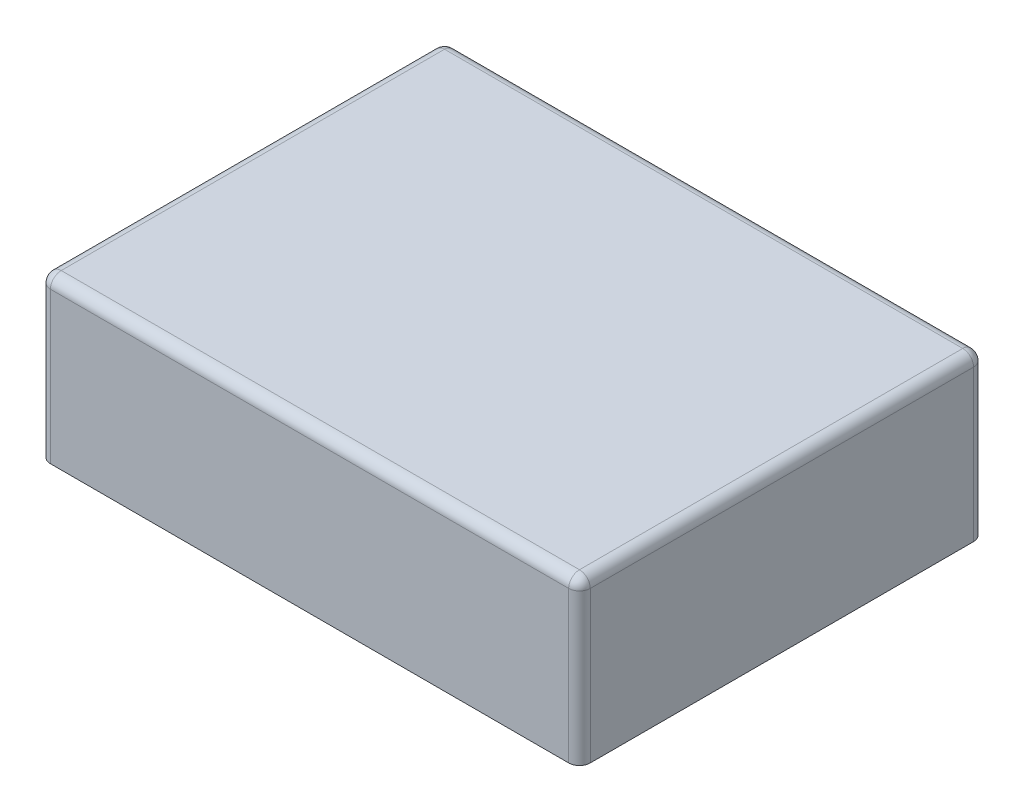
ISO-10303-21;
HEADER;
FILE_DESCRIPTION(('STEP AP214'),'2;1');
FILE_NAME('part.step','',(''),(''),'','','');
FILE_SCHEMA(('AUTOMOTIVE_DESIGN { 1 0 10303 214 1 1 1 1 }'));
ENDSEC;
DATA;
#1=APPLICATION_CONTEXT('core data for automotive mechanical design processes');
#2=APPLICATION_PROTOCOL_DEFINITION('international standard','automotive_design',2000,#1);
#3=PRODUCT_CONTEXT('',#1,'mechanical');
#4=PRODUCT('Part','Part','',(#3));
#5=PRODUCT_RELATED_PRODUCT_CATEGORY('part','',(#4));
#6=PRODUCT_DEFINITION_FORMATION('','',#4);
#7=PRODUCT_DEFINITION_CONTEXT('part definition',#1,'design');
#8=PRODUCT_DEFINITION('design','',#6,#7);
#9=PRODUCT_DEFINITION_SHAPE('','',#8);
#10=(LENGTH_UNIT() NAMED_UNIT(*) SI_UNIT(.MILLI.,.METRE.));
#11=(NAMED_UNIT(*) PLANE_ANGLE_UNIT() SI_UNIT($,.RADIAN.));
#12=(NAMED_UNIT(*) SI_UNIT($,.STERADIAN.) SOLID_ANGLE_UNIT());
#13=UNCERTAINTY_MEASURE_WITH_UNIT(LENGTH_MEASURE(1.E-05),#10,'distance_accuracy_value','');
#14=(GEOMETRIC_REPRESENTATION_CONTEXT(3) GLOBAL_UNCERTAINTY_ASSIGNED_CONTEXT((#13)) GLOBAL_UNIT_ASSIGNED_CONTEXT((#10,
#11,#12)) REPRESENTATION_CONTEXT('',''));
#15=CARTESIAN_POINT('',(0.,0.,0.));
#16=DIRECTION('',(0.,0.,1.));
#17=DIRECTION('',(1.,0.,0.));
#18=AXIS2_PLACEMENT_3D('',#15,#16,#17);
#19=CARTESIAN_POINT('',(50.,30.,-37.5));
#20=DIRECTION('',(-1.,0.,0.));
#21=DIRECTION('',(0.,0.,1.));
#22=AXIS2_PLACEMENT_3D('',#19,#20,#21);
#23=PLANE('',#22);
#24=DIRECTION('',(0.,0.,-1.));
#25=VECTOR('',#24,1.);
#26=CARTESIAN_POINT('',(50.,0.,-37.5));
#27=LINE('',#26,#25);
#28=CARTESIAN_POINT('',(50.,0.,35.5));
#29=VERTEX_POINT('',#28);
#30=CARTESIAN_POINT('',(50.,0.,-35.5));
#31=VERTEX_POINT('',#30);
#32=EDGE_CURVE('E159',#29,#31,#27,.T.);
#33=ORIENTED_EDGE('',*,*,#32,.T.);
#34=DIRECTION('',(0.,-1.,0.));
#35=VECTOR('',#34,1.);
#36=CARTESIAN_POINT('',(50.,30.,-35.5));
#37=LINE('',#36,#35);
#38=CARTESIAN_POINT('',(50.,28.,-35.5));
#39=VERTEX_POINT('',#38);
#40=EDGE_CURVE('E50',#31,#39,#37,.F.);
#41=ORIENTED_EDGE('',*,*,#40,.T.);
#42=DIRECTION('',(0.,0.,-1.));
#43=VECTOR('',#42,1.);
#44=CARTESIAN_POINT('',(50.,28.,37.5));
#45=LINE('',#44,#43);
#46=CARTESIAN_POINT('',(50.,28.,35.5));
#47=VERTEX_POINT('',#46);
#48=EDGE_CURVE('E55',#39,#47,#45,.F.);
#49=ORIENTED_EDGE('',*,*,#48,.T.);
#50=DIRECTION('',(0.,-1.,0.));
#51=VECTOR('',#50,1.);
#52=CARTESIAN_POINT('',(50.,30.,35.5));
#53=LINE('',#52,#51);
#54=EDGE_CURVE('E216',#47,#29,#53,.T.);
#55=ORIENTED_EDGE('',*,*,#54,.T.);
#56=EDGE_LOOP('',(#33,#41,#49,#55));
#57=FACE_BOUND('',#56,.T.);
#58=ADVANCED_FACE('F33',(#57),#23,.F.);
#59=CARTESIAN_POINT('',(-50.,30.,-37.5));
#60=DIRECTION('',(0.,0.,1.));
#61=DIRECTION('',(1.,0.,0.));
#62=AXIS2_PLACEMENT_3D('',#59,#60,#61);
#63=PLANE('',#62);
#64=DIRECTION('',(-1.,0.,0.));
#65=VECTOR('',#64,1.);
#66=CARTESIAN_POINT('',(-50.,0.,-37.5));
#67=LINE('',#66,#65);
#68=CARTESIAN_POINT('',(48.,0.,-37.5));
#69=VERTEX_POINT('',#68);
#70=CARTESIAN_POINT('',(-48.,0.,-37.5));
#71=VERTEX_POINT('',#70);
#72=EDGE_CURVE('E162',#69,#71,#67,.T.);
#73=ORIENTED_EDGE('',*,*,#72,.T.);
#74=DIRECTION('',(0.,-1.,0.));
#75=VECTOR('',#74,1.);
#76=CARTESIAN_POINT('',(-48.,30.,-37.5));
#77=LINE('',#76,#75);
#78=CARTESIAN_POINT('',(-48.,28.,-37.5));
#79=VERTEX_POINT('',#78);
#80=EDGE_CURVE('E214',#71,#79,#77,.F.);
#81=ORIENTED_EDGE('',*,*,#80,.T.);
#82=DIRECTION('',(-1.,0.,0.));
#83=VECTOR('',#82,1.);
#84=CARTESIAN_POINT('',(50.,28.,-37.5));
#85=LINE('',#84,#83);
#86=CARTESIAN_POINT('',(48.,28.,-37.5));
#87=VERTEX_POINT('',#86);
#88=EDGE_CURVE('E212',#79,#87,#85,.F.);
#89=ORIENTED_EDGE('',*,*,#88,.T.);
#90=DIRECTION('',(0.,-1.,0.));
#91=VECTOR('',#90,1.);
#92=CARTESIAN_POINT('',(48.,30.,-37.5));
#93=LINE('',#92,#91);
#94=EDGE_CURVE('E210',#87,#69,#93,.T.);
#95=ORIENTED_EDGE('',*,*,#94,.T.);
#96=EDGE_LOOP('',(#73,#81,#89,#95));
#97=FACE_BOUND('',#96,.T.);
#98=ADVANCED_FACE('F281',(#97),#63,.F.);
#99=CARTESIAN_POINT('',(-50.,30.,-37.5));
#100=DIRECTION('',(1.,0.,0.));
#101=DIRECTION('',(0.,0.,-1.));
#102=AXIS2_PLACEMENT_3D('',#99,#100,#101);
#103=PLANE('',#102);
#104=DIRECTION('',(0.,0.,1.));
#105=VECTOR('',#104,1.);
#106=CARTESIAN_POINT('',(-50.,28.,-37.5));
#107=LINE('',#106,#105);
#108=CARTESIAN_POINT('',(-50.,28.,35.5));
#109=VERTEX_POINT('',#108);
#110=CARTESIAN_POINT('',(-50.,28.,-35.5));
#111=VERTEX_POINT('',#110);
#112=EDGE_CURVE('E206',#109,#111,#107,.F.);
#113=ORIENTED_EDGE('',*,*,#112,.T.);
#114=DIRECTION('',(0.,-1.,0.));
#115=VECTOR('',#114,1.);
#116=CARTESIAN_POINT('',(-50.,30.,-35.5));
#117=LINE('',#116,#115);
#118=CARTESIAN_POINT('',(-50.,0.,-35.5));
#119=VERTEX_POINT('',#118);
#120=EDGE_CURVE('E208',#111,#119,#117,.T.);
#121=ORIENTED_EDGE('',*,*,#120,.T.);
#122=DIRECTION('',(0.,0.,1.));
#123=VECTOR('',#122,1.);
#124=CARTESIAN_POINT('',(-50.,0.,-37.5));
#125=LINE('',#124,#123);
#126=CARTESIAN_POINT('',(-50.,0.,35.5));
#127=VERTEX_POINT('',#126);
#128=EDGE_CURVE('E182',#119,#127,#125,.T.);
#129=ORIENTED_EDGE('',*,*,#128,.T.);
#130=DIRECTION('',(0.,-1.,0.));
#131=VECTOR('',#130,1.);
#132=CARTESIAN_POINT('',(-50.,30.,35.5));
#133=LINE('',#132,#131);
#134=EDGE_CURVE('E204',#127,#109,#133,.F.);
#135=ORIENTED_EDGE('',*,*,#134,.T.);
#136=EDGE_LOOP('',(#113,#121,#129,#135));
#137=FACE_BOUND('',#136,.T.);
#138=ADVANCED_FACE('F314',(#137),#103,.F.);
#139=CARTESIAN_POINT('',(-50.,30.,37.5));
#140=DIRECTION('',(0.,0.,-1.));
#141=DIRECTION('',(-1.,0.,0.));
#142=AXIS2_PLACEMENT_3D('',#139,#140,#141);
#143=PLANE('',#142);
#144=DIRECTION('',(1.,0.,0.));
#145=VECTOR('',#144,1.);
#146=CARTESIAN_POINT('',(-50.,0.,37.5));
#147=LINE('',#146,#145);
#148=CARTESIAN_POINT('',(-48.,0.,37.5));
#149=VERTEX_POINT('',#148);
#150=CARTESIAN_POINT('',(48.,0.,37.5));
#151=VERTEX_POINT('',#150);
#152=EDGE_CURVE('E185',#149,#151,#147,.T.);
#153=ORIENTED_EDGE('',*,*,#152,.T.);
#154=DIRECTION('',(0.,-1.,0.));
#155=VECTOR('',#154,1.);
#156=CARTESIAN_POINT('',(48.,30.,37.5));
#157=LINE('',#156,#155);
#158=CARTESIAN_POINT('',(48.,28.,37.5));
#159=VERTEX_POINT('',#158);
#160=EDGE_CURVE('E202',#151,#159,#157,.F.);
#161=ORIENTED_EDGE('',*,*,#160,.T.);
#162=DIRECTION('',(1.,0.,0.));
#163=VECTOR('',#162,1.);
#164=CARTESIAN_POINT('',(-50.,28.,37.5));
#165=LINE('',#164,#163);
#166=CARTESIAN_POINT('',(-48.,28.,37.5));
#167=VERTEX_POINT('',#166);
#168=EDGE_CURVE('E199',#159,#167,#165,.F.);
#169=ORIENTED_EDGE('',*,*,#168,.T.);
#170=DIRECTION('',(0.,-1.,0.));
#171=VECTOR('',#170,1.);
#172=CARTESIAN_POINT('',(-48.,30.,37.5));
#173=LINE('',#172,#171);
#174=EDGE_CURVE('E197',#167,#149,#173,.T.);
#175=ORIENTED_EDGE('',*,*,#174,.T.);
#176=EDGE_LOOP('',(#153,#161,#169,#175));
#177=FACE_BOUND('',#176,.T.);
#178=ADVANCED_FACE('F306',(#177),#143,.F.);
#179=CARTESIAN_POINT('',(0.,30.,0.));
#180=DIRECTION('',(0.,1.,0.));
#181=DIRECTION('',(0.,0.,1.));
#182=AXIS2_PLACEMENT_3D('',#179,#180,#181);
#183=PLANE('',#182);
#184=DIRECTION('',(0.,0.,1.));
#185=VECTOR('',#184,1.);
#186=CARTESIAN_POINT('',(-48.,30.,37.5));
#187=LINE('',#186,#185);
#188=CARTESIAN_POINT('',(-48.,30.,-35.5));
#189=VERTEX_POINT('',#188);
#190=CARTESIAN_POINT('',(-48.,30.,35.5));
#191=VERTEX_POINT('',#190);
#192=EDGE_CURVE('E192',#189,#191,#187,.T.);
#193=ORIENTED_EDGE('',*,*,#192,.T.);
#194=DIRECTION('',(1.,0.,0.));
#195=VECTOR('',#194,1.);
#196=CARTESIAN_POINT('',(50.,30.,35.5));
#197=LINE('',#196,#195);
#198=CARTESIAN_POINT('',(48.,30.,35.5));
#199=VERTEX_POINT('',#198);
#200=EDGE_CURVE('E194',#191,#199,#197,.T.);
#201=ORIENTED_EDGE('',*,*,#200,.T.);
#202=DIRECTION('',(0.,0.,-1.));
#203=VECTOR('',#202,1.);
#204=CARTESIAN_POINT('',(48.,30.,-37.5));
#205=LINE('',#204,#203);
#206=CARTESIAN_POINT('',(48.,30.,-35.5));
#207=VERTEX_POINT('',#206);
#208=EDGE_CURVE('E188',#199,#207,#205,.T.);
#209=ORIENTED_EDGE('',*,*,#208,.T.);
#210=DIRECTION('',(-1.,0.,0.));
#211=VECTOR('',#210,1.);
#212=CARTESIAN_POINT('',(-50.,30.,-35.5));
#213=LINE('',#212,#211);
#214=EDGE_CURVE('E190',#207,#189,#213,.T.);
#215=ORIENTED_EDGE('',*,*,#214,.T.);
#216=EDGE_LOOP('',(#193,#201,#209,#215));
#217=FACE_BOUND('',#216,.T.);
#218=ADVANCED_FACE('F271',(#217),#183,.T.);
#219=CARTESIAN_POINT('',(0.,0.,0.));
#220=DIRECTION('',(0.,1.,0.));
#221=DIRECTION('',(0.,0.,1.));
#222=AXIS2_PLACEMENT_3D('',#219,#220,#221);
#223=PLANE('',#222);
#224=DIRECTION('',(1.,0.,0.));
#225=VECTOR('',#224,1.);
#226=CARTESIAN_POINT('',(-50.,0.,35.5));
#227=LINE('',#226,#225);
#228=CARTESIAN_POINT('',(-48.,0.,35.5));
#229=VERTEX_POINT('',#228);
#230=CARTESIAN_POINT('',(48.,0.,35.5));
#231=VERTEX_POINT('',#230);
#232=EDGE_CURVE('E154',#229,#231,#227,.T.);
#233=ORIENTED_EDGE('',*,*,#232,.T.);
#234=DIRECTION('',(0.,0.,-1.));
#235=VECTOR('',#234,1.);
#236=CARTESIAN_POINT('',(48.,0.,-37.5));
#237=LINE('',#236,#235);
#238=CARTESIAN_POINT('',(48.,0.,-35.5));
#239=VERTEX_POINT('',#238);
#240=EDGE_CURVE('E172',#231,#239,#237,.T.);
#241=ORIENTED_EDGE('',*,*,#240,.T.);
#242=DIRECTION('',(-1.,0.,0.));
#243=VECTOR('',#242,1.);
#244=CARTESIAN_POINT('',(-50.,0.,-35.5));
#245=LINE('',#244,#243);
#246=CARTESIAN_POINT('',(-48.,0.,-35.5));
#247=VERTEX_POINT('',#246);
#248=EDGE_CURVE('E158',#239,#247,#245,.T.);
#249=ORIENTED_EDGE('',*,*,#248,.T.);
#250=DIRECTION('',(0.,0.,1.));
#251=VECTOR('',#250,1.);
#252=CARTESIAN_POINT('',(-48.,0.,-37.5));
#253=LINE('',#252,#251);
#254=EDGE_CURVE('E176',#247,#229,#253,.T.);
#255=ORIENTED_EDGE('',*,*,#254,.T.);
#256=EDGE_LOOP('',(#233,#241,#249,#255));
#257=FACE_BOUND('',#256,.T.);
#258=ORIENTED_EDGE('',*,*,#128,.F.);
#259=CARTESIAN_POINT('',(-48.,0.,-35.5));
#260=DIRECTION('',(0.,1.,0.));
#261=DIRECTION('',(0.,0.,1.));
#262=AXIS2_PLACEMENT_3D('',#259,#260,#261);
#263=CIRCLE('',#262,2.);
#264=EDGE_CURVE('E11',#119,#71,#263,.F.);
#265=ORIENTED_EDGE('',*,*,#264,.T.);
#266=ORIENTED_EDGE('',*,*,#72,.F.);
#267=CARTESIAN_POINT('',(48.,0.,-35.5));
#268=DIRECTION('',(0.,1.,0.));
#269=DIRECTION('',(0.,0.,1.));
#270=AXIS2_PLACEMENT_3D('',#267,#268,#269);
#271=CIRCLE('',#270,2.);
#272=EDGE_CURVE('E42',#69,#31,#271,.F.);
#273=ORIENTED_EDGE('',*,*,#272,.T.);
#274=ORIENTED_EDGE('',*,*,#32,.F.);
#275=CARTESIAN_POINT('',(48.,0.,35.5));
#276=DIRECTION('',(0.,1.,0.));
#277=DIRECTION('',(0.,0.,1.));
#278=AXIS2_PLACEMENT_3D('',#275,#276,#277);
#279=CIRCLE('',#278,2.);
#280=EDGE_CURVE('E222',#29,#151,#279,.F.);
#281=ORIENTED_EDGE('',*,*,#280,.T.);
#282=ORIENTED_EDGE('',*,*,#152,.F.);
#283=CARTESIAN_POINT('',(-48.,0.,35.5));
#284=DIRECTION('',(0.,1.,0.));
#285=DIRECTION('',(0.,0.,1.));
#286=AXIS2_PLACEMENT_3D('',#283,#284,#285);
#287=CIRCLE('',#286,2.);
#288=EDGE_CURVE('E220',#149,#127,#287,.F.);
#289=ORIENTED_EDGE('',*,*,#288,.T.);
#290=EDGE_LOOP('',(#258,#265,#266,#273,#274,#281,#282,#289));
#291=FACE_BOUND('',#290,.T.);
#292=ADVANCED_FACE('F290',(#257,#291),#223,.F.);
#293=CARTESIAN_POINT('',(48.,30.,-37.5));
#294=DIRECTION('',(-1.,0.,0.));
#295=DIRECTION('',(0.,0.,1.));
#296=AXIS2_PLACEMENT_3D('',#293,#294,#295);
#297=PLANE('',#296);
#298=ORIENTED_EDGE('',*,*,#240,.F.);
#299=DIRECTION('',(0.,-1.,0.));
#300=VECTOR('',#299,1.);
#301=CARTESIAN_POINT('',(48.,30.,35.5));
#302=LINE('',#301,#300);
#303=CARTESIAN_POINT('',(48.,28.,35.5));
#304=VERTEX_POINT('',#303);
#305=EDGE_CURVE('E153',#304,#231,#302,.T.);
#306=ORIENTED_EDGE('',*,*,#305,.F.);
#307=DIRECTION('',(0.,0.,-1.));
#308=VECTOR('',#307,1.);
#309=CARTESIAN_POINT('',(48.,28.,-37.5));
#310=LINE('',#309,#308);
#311=CARTESIAN_POINT('',(48.,28.,-35.5));
#312=VERTEX_POINT('',#311);
#313=EDGE_CURVE('E139',#304,#312,#310,.T.);
#314=ORIENTED_EDGE('',*,*,#313,.T.);
#315=DIRECTION('',(0.,-1.,0.));
#316=VECTOR('',#315,1.);
#317=CARTESIAN_POINT('',(48.,30.,-35.5));
#318=LINE('',#317,#316);
#319=EDGE_CURVE('E151',#312,#239,#318,.T.);
#320=ORIENTED_EDGE('',*,*,#319,.T.);
#321=EDGE_LOOP('',(#298,#306,#314,#320));
#322=FACE_BOUND('',#321,.T.);
#323=ADVANCED_FACE('F150',(#322),#297,.T.);
#324=CARTESIAN_POINT('',(-50.,30.,-35.5));
#325=DIRECTION('',(0.,0.,1.));
#326=DIRECTION('',(1.,0.,0.));
#327=AXIS2_PLACEMENT_3D('',#324,#325,#326);
#328=PLANE('',#327);
#329=ORIENTED_EDGE('',*,*,#248,.F.);
#330=ORIENTED_EDGE('',*,*,#319,.F.);
#331=DIRECTION('',(-1.,0.,0.));
#332=VECTOR('',#331,1.);
#333=CARTESIAN_POINT('',(-50.,28.,-35.5));
#334=LINE('',#333,#332);
#335=CARTESIAN_POINT('',(-48.,28.,-35.5));
#336=VERTEX_POINT('',#335);
#337=EDGE_CURVE('E135',#312,#336,#334,.T.);
#338=ORIENTED_EDGE('',*,*,#337,.T.);
#339=DIRECTION('',(0.,-1.,0.));
#340=VECTOR('',#339,1.);
#341=CARTESIAN_POINT('',(-48.,30.,-35.5));
#342=LINE('',#341,#340);
#343=EDGE_CURVE('E160',#336,#247,#342,.T.);
#344=ORIENTED_EDGE('',*,*,#343,.T.);
#345=EDGE_LOOP('',(#329,#330,#338,#344));
#346=FACE_BOUND('',#345,.T.);
#347=ADVANCED_FACE('F156',(#346),#328,.T.);
#348=CARTESIAN_POINT('',(-48.,30.,-37.5));
#349=DIRECTION('',(1.,0.,0.));
#350=DIRECTION('',(0.,0.,-1.));
#351=AXIS2_PLACEMENT_3D('',#348,#349,#350);
#352=PLANE('',#351);
#353=ORIENTED_EDGE('',*,*,#254,.F.);
#354=ORIENTED_EDGE('',*,*,#343,.F.);
#355=DIRECTION('',(0.,0.,1.));
#356=VECTOR('',#355,1.);
#357=CARTESIAN_POINT('',(-48.,28.,-37.5));
#358=LINE('',#357,#356);
#359=CARTESIAN_POINT('',(-48.,28.,35.5));
#360=VERTEX_POINT('',#359);
#361=EDGE_CURVE('E140',#336,#360,#358,.T.);
#362=ORIENTED_EDGE('',*,*,#361,.T.);
#363=DIRECTION('',(0.,-1.,0.));
#364=VECTOR('',#363,1.);
#365=CARTESIAN_POINT('',(-48.,30.,35.5));
#366=LINE('',#365,#364);
#367=EDGE_CURVE('E164',#360,#229,#366,.T.);
#368=ORIENTED_EDGE('',*,*,#367,.T.);
#369=EDGE_LOOP('',(#353,#354,#362,#368));
#370=FACE_BOUND('',#369,.T.);
#371=ADVANCED_FACE('F436',(#370),#352,.T.);
#372=CARTESIAN_POINT('',(-50.,30.,35.5));
#373=DIRECTION('',(0.,0.,-1.));
#374=DIRECTION('',(-1.,0.,0.));
#375=AXIS2_PLACEMENT_3D('',#372,#373,#374);
#376=PLANE('',#375);
#377=ORIENTED_EDGE('',*,*,#232,.F.);
#378=ORIENTED_EDGE('',*,*,#367,.F.);
#379=DIRECTION('',(1.,0.,0.));
#380=VECTOR('',#379,1.);
#381=CARTESIAN_POINT('',(-50.,28.,35.5));
#382=LINE('',#381,#380);
#383=EDGE_CURVE('E167',#360,#304,#382,.T.);
#384=ORIENTED_EDGE('',*,*,#383,.T.);
#385=ORIENTED_EDGE('',*,*,#305,.T.);
#386=EDGE_LOOP('',(#377,#378,#384,#385));
#387=FACE_BOUND('',#386,.T.);
#388=ADVANCED_FACE('F321',(#387),#376,.T.);
#389=CARTESIAN_POINT('',(0.,28.,0.));
#390=DIRECTION('',(0.,1.,0.));
#391=DIRECTION('',(0.,0.,1.));
#392=AXIS2_PLACEMENT_3D('',#389,#390,#391);
#393=PLANE('',#392);
#394=ORIENTED_EDGE('',*,*,#313,.F.);
#395=ORIENTED_EDGE('',*,*,#383,.F.);
#396=ORIENTED_EDGE('',*,*,#361,.F.);
#397=ORIENTED_EDGE('',*,*,#337,.F.);
#398=EDGE_LOOP('',(#394,#395,#396,#397));
#399=FACE_BOUND('',#398,.T.);
#400=ADVANCED_FACE('F137',(#399),#393,.F.);
#401=CARTESIAN_POINT('',(-48.,30.,-35.5));
#402=DIRECTION('',(0.,-1.,0.));
#403=DIRECTION('',(0.,0.,-1.));
#404=AXIS2_PLACEMENT_3D('',#401,#402,#403);
#405=CYLINDRICAL_SURFACE('',#404,2.);
#406=ORIENTED_EDGE('',*,*,#264,.F.);
#407=ORIENTED_EDGE('',*,*,#120,.F.);
#408=CARTESIAN_POINT('',(-48.,28.,-35.5));
#409=DIRECTION('',(0.,1.,0.));
#410=DIRECTION('',(0.,0.,1.));
#411=AXIS2_PLACEMENT_3D('',#408,#409,#410);
#412=CIRCLE('',#411,2.);
#413=EDGE_CURVE('E37',#79,#111,#412,.T.);
#414=ORIENTED_EDGE('',*,*,#413,.F.);
#415=ORIENTED_EDGE('',*,*,#80,.F.);
#416=EDGE_LOOP('',(#406,#407,#414,#415));
#417=FACE_BOUND('',#416,.T.);
#418=ADVANCED_FACE('F35',(#417),#405,.T.);
#419=CARTESIAN_POINT('',(0.,28.,-35.5));
#420=DIRECTION('',(1.,0.,0.));
#421=DIRECTION('',(0.,0.,-1.));
#422=AXIS2_PLACEMENT_3D('',#419,#420,#421);
#423=CYLINDRICAL_SURFACE('',#422,2.);
#424=CARTESIAN_POINT('',(48.,28.,-35.5));
#425=DIRECTION('',(1.,0.,0.));
#426=DIRECTION('',(0.,1.,0.));
#427=AXIS2_PLACEMENT_3D('',#424,#425,#426);
#428=CIRCLE('',#427,2.);
#429=EDGE_CURVE('E250',#87,#207,#428,.T.);
#430=ORIENTED_EDGE('',*,*,#429,.F.);
#431=ORIENTED_EDGE('',*,*,#88,.F.);
#432=CARTESIAN_POINT('',(-48.,28.,-35.5));
#433=DIRECTION('',(-1.,0.,0.));
#434=DIRECTION('',(0.,0.,1.));
#435=AXIS2_PLACEMENT_3D('',#432,#433,#434);
#436=CIRCLE('',#435,2.);
#437=EDGE_CURVE('E252',#189,#79,#436,.T.);
#438=ORIENTED_EDGE('',*,*,#437,.F.);
#439=ORIENTED_EDGE('',*,*,#214,.F.);
#440=EDGE_LOOP('',(#430,#431,#438,#439));
#441=FACE_BOUND('',#440,.T.);
#442=ADVANCED_FACE('F278',(#441),#423,.T.);
#443=CARTESIAN_POINT('',(48.,30.,-35.5));
#444=DIRECTION('',(0.,-1.,0.));
#445=DIRECTION('',(0.,0.,-1.));
#446=AXIS2_PLACEMENT_3D('',#443,#444,#445);
#447=CYLINDRICAL_SURFACE('',#446,2.);
#448=ORIENTED_EDGE('',*,*,#272,.F.);
#449=ORIENTED_EDGE('',*,*,#94,.F.);
#450=CARTESIAN_POINT('',(48.,28.,-35.5));
#451=DIRECTION('',(0.,1.,0.));
#452=DIRECTION('',(0.,0.,1.));
#453=AXIS2_PLACEMENT_3D('',#450,#451,#452);
#454=CIRCLE('',#453,2.);
#455=EDGE_CURVE('E247',#39,#87,#454,.T.);
#456=ORIENTED_EDGE('',*,*,#455,.F.);
#457=ORIENTED_EDGE('',*,*,#40,.F.);
#458=EDGE_LOOP('',(#448,#449,#456,#457));
#459=FACE_BOUND('',#458,.T.);
#460=ADVANCED_FACE('F285',(#459),#447,.T.);
#461=CARTESIAN_POINT('',(-48.,28.,-35.5));
#462=DIRECTION('',(0.,0.,1.));
#463=DIRECTION('',(1.,0.,0.));
#464=AXIS2_PLACEMENT_3D('',#461,#462,#463);
#465=SPHERICAL_SURFACE('',#464,2.);
#466=ORIENTED_EDGE('',*,*,#437,.T.);
#467=ORIENTED_EDGE('',*,*,#413,.T.);
#468=CARTESIAN_POINT('',(-48.,28.,-35.5));
#469=DIRECTION('',(0.,0.,-1.));
#470=DIRECTION('',(-1.,0.,0.));
#471=AXIS2_PLACEMENT_3D('',#468,#469,#470);
#472=CIRCLE('',#471,2.);
#473=EDGE_CURVE('E244',#189,#111,#472,.F.);
#474=ORIENTED_EDGE('',*,*,#473,.F.);
#475=EDGE_LOOP('',(#466,#467,#474));
#476=FACE_BOUND('',#475,.T.);
#477=ADVANCED_FACE('F259',(#476),#465,.T.);
#478=CARTESIAN_POINT('',(48.,28.,-35.5));
#479=DIRECTION('',(0.,0.,1.));
#480=DIRECTION('',(1.,0.,0.));
#481=AXIS2_PLACEMENT_3D('',#478,#479,#480);
#482=SPHERICAL_SURFACE('',#481,2.);
#483=ORIENTED_EDGE('',*,*,#455,.T.);
#484=ORIENTED_EDGE('',*,*,#429,.T.);
#485=CARTESIAN_POINT('',(48.,28.,-35.5));
#486=DIRECTION('',(0.,0.,-1.));
#487=DIRECTION('',(-1.,0.,0.));
#488=AXIS2_PLACEMENT_3D('',#485,#486,#487);
#489=CIRCLE('',#488,2.);
#490=EDGE_CURVE('E241',#39,#207,#489,.F.);
#491=ORIENTED_EDGE('',*,*,#490,.F.);
#492=EDGE_LOOP('',(#483,#484,#491));
#493=FACE_BOUND('',#492,.T.);
#494=ADVANCED_FACE('F347',(#493),#482,.T.);
#495=CARTESIAN_POINT('',(-48.,30.,35.5));
#496=DIRECTION('',(0.,-1.,0.));
#497=DIRECTION('',(0.,0.,-1.));
#498=AXIS2_PLACEMENT_3D('',#495,#496,#497);
#499=CYLINDRICAL_SURFACE('',#498,2.);
#500=ORIENTED_EDGE('',*,*,#288,.F.);
#501=ORIENTED_EDGE('',*,*,#174,.F.);
#502=CARTESIAN_POINT('',(-48.,28.,35.5));
#503=DIRECTION('',(0.,1.,0.));
#504=DIRECTION('',(0.,0.,1.));
#505=AXIS2_PLACEMENT_3D('',#502,#503,#504);
#506=CIRCLE('',#505,2.);
#507=EDGE_CURVE('E238',#109,#167,#506,.T.);
#508=ORIENTED_EDGE('',*,*,#507,.F.);
#509=ORIENTED_EDGE('',*,*,#134,.F.);
#510=EDGE_LOOP('',(#500,#501,#508,#509));
#511=FACE_BOUND('',#510,.T.);
#512=ADVANCED_FACE('F312',(#511),#499,.T.);
#513=CARTESIAN_POINT('',(-48.,28.,0.));
#514=DIRECTION('',(0.,0.,-1.));
#515=DIRECTION('',(-1.,0.,0.));
#516=AXIS2_PLACEMENT_3D('',#513,#514,#515);
#517=CYLINDRICAL_SURFACE('',#516,2.);
#518=ORIENTED_EDGE('',*,*,#473,.T.);
#519=ORIENTED_EDGE('',*,*,#112,.F.);
#520=CARTESIAN_POINT('',(-48.,28.,35.5));
#521=DIRECTION('',(0.,0.,1.));
#522=DIRECTION('',(1.,0.,0.));
#523=AXIS2_PLACEMENT_3D('',#520,#521,#522);
#524=CIRCLE('',#523,2.);
#525=EDGE_CURVE('E235',#191,#109,#524,.T.);
#526=ORIENTED_EDGE('',*,*,#525,.F.);
#527=ORIENTED_EDGE('',*,*,#192,.F.);
#528=EDGE_LOOP('',(#518,#519,#526,#527));
#529=FACE_BOUND('',#528,.T.);
#530=ADVANCED_FACE('F266',(#529),#517,.T.);
#531=CARTESIAN_POINT('',(48.,28.,0.));
#532=DIRECTION('',(0.,0.,1.));
#533=DIRECTION('',(1.,0.,0.));
#534=AXIS2_PLACEMENT_3D('',#531,#532,#533);
#535=CYLINDRICAL_SURFACE('',#534,2.);
#536=ORIENTED_EDGE('',*,*,#490,.T.);
#537=ORIENTED_EDGE('',*,*,#208,.F.);
#538=CARTESIAN_POINT('',(48.,28.,35.5));
#539=DIRECTION('',(0.,0.,1.));
#540=DIRECTION('',(0.,-1.,0.));
#541=AXIS2_PLACEMENT_3D('',#538,#539,#540);
#542=CIRCLE('',#541,2.);
#543=EDGE_CURVE('E232',#47,#199,#542,.T.);
#544=ORIENTED_EDGE('',*,*,#543,.F.);
#545=ORIENTED_EDGE('',*,*,#48,.F.);
#546=EDGE_LOOP('',(#536,#537,#544,#545));
#547=FACE_BOUND('',#546,.T.);
#548=ADVANCED_FACE('F299',(#547),#535,.T.);
#549=CARTESIAN_POINT('',(48.,30.,35.5));
#550=DIRECTION('',(0.,-1.,0.));
#551=DIRECTION('',(0.,0.,-1.));
#552=AXIS2_PLACEMENT_3D('',#549,#550,#551);
#553=CYLINDRICAL_SURFACE('',#552,2.);
#554=ORIENTED_EDGE('',*,*,#280,.F.);
#555=ORIENTED_EDGE('',*,*,#54,.F.);
#556=CARTESIAN_POINT('',(48.,28.,35.5));
#557=DIRECTION('',(0.,1.,0.));
#558=DIRECTION('',(0.,0.,1.));
#559=AXIS2_PLACEMENT_3D('',#556,#557,#558);
#560=CIRCLE('',#559,2.);
#561=EDGE_CURVE('E229',#159,#47,#560,.T.);
#562=ORIENTED_EDGE('',*,*,#561,.F.);
#563=ORIENTED_EDGE('',*,*,#160,.F.);
#564=EDGE_LOOP('',(#554,#555,#562,#563));
#565=FACE_BOUND('',#564,.T.);
#566=ADVANCED_FACE('F295',(#565),#553,.T.);
#567=CARTESIAN_POINT('',(-48.,28.,35.5));
#568=DIRECTION('',(0.,0.,1.));
#569=DIRECTION('',(1.,0.,0.));
#570=AXIS2_PLACEMENT_3D('',#567,#568,#569);
#571=SPHERICAL_SURFACE('',#570,2.);
#572=ORIENTED_EDGE('',*,*,#525,.T.);
#573=ORIENTED_EDGE('',*,*,#507,.T.);
#574=CARTESIAN_POINT('',(-48.,28.,35.5));
#575=DIRECTION('',(-1.,0.,0.));
#576=DIRECTION('',(0.,0.,1.));
#577=AXIS2_PLACEMENT_3D('',#574,#575,#576);
#578=CIRCLE('',#577,2.);
#579=EDGE_CURVE('E227',#191,#167,#578,.F.);
#580=ORIENTED_EDGE('',*,*,#579,.F.);
#581=EDGE_LOOP('',(#572,#573,#580));
#582=FACE_BOUND('',#581,.T.);
#583=ADVANCED_FACE('F335',(#582),#571,.T.);
#584=CARTESIAN_POINT('',(48.,28.,35.5));
#585=DIRECTION('',(0.,0.,1.));
#586=DIRECTION('',(1.,0.,0.));
#587=AXIS2_PLACEMENT_3D('',#584,#585,#586);
#588=SPHERICAL_SURFACE('',#587,2.);
#589=ORIENTED_EDGE('',*,*,#561,.T.);
#590=ORIENTED_EDGE('',*,*,#543,.T.);
#591=CARTESIAN_POINT('',(48.,28.,35.5));
#592=DIRECTION('',(1.,0.,0.));
#593=DIRECTION('',(0.,0.,-1.));
#594=AXIS2_PLACEMENT_3D('',#591,#592,#593);
#595=CIRCLE('',#594,2.);
#596=EDGE_CURVE('E225',#159,#199,#595,.F.);
#597=ORIENTED_EDGE('',*,*,#596,.F.);
#598=EDGE_LOOP('',(#589,#590,#597));
#599=FACE_BOUND('',#598,.T.);
#600=ADVANCED_FACE('F302',(#599),#588,.T.);
#601=CARTESIAN_POINT('',(0.,28.,35.5));
#602=DIRECTION('',(-1.,0.,0.));
#603=DIRECTION('',(0.,0.,1.));
#604=AXIS2_PLACEMENT_3D('',#601,#602,#603);
#605=CYLINDRICAL_SURFACE('',#604,2.);
#606=ORIENTED_EDGE('',*,*,#579,.T.);
#607=ORIENTED_EDGE('',*,*,#168,.F.);
#608=ORIENTED_EDGE('',*,*,#596,.T.);
#609=ORIENTED_EDGE('',*,*,#200,.F.);
#610=EDGE_LOOP('',(#606,#607,#608,#609));
#611=FACE_BOUND('',#610,.T.);
#612=ADVANCED_FACE('F304',(#611),#605,.T.);
#613=CLOSED_SHELL('',(#58,#98,#138,#178,#218,#292,#323,#347,#371,#388,#400,#418,#442,#460,#477,
#494,#512,#530,#548,#566,#583,#600,#612));
#614=MANIFOLD_SOLID_BREP('B2',#613);
#615=ADVANCED_BREP_SHAPE_REPRESENTATION('',(#18,#614),#14);
#616=SHAPE_DEFINITION_REPRESENTATION(#9,#615);
ENDSEC;
END-ISO-10303-21;
